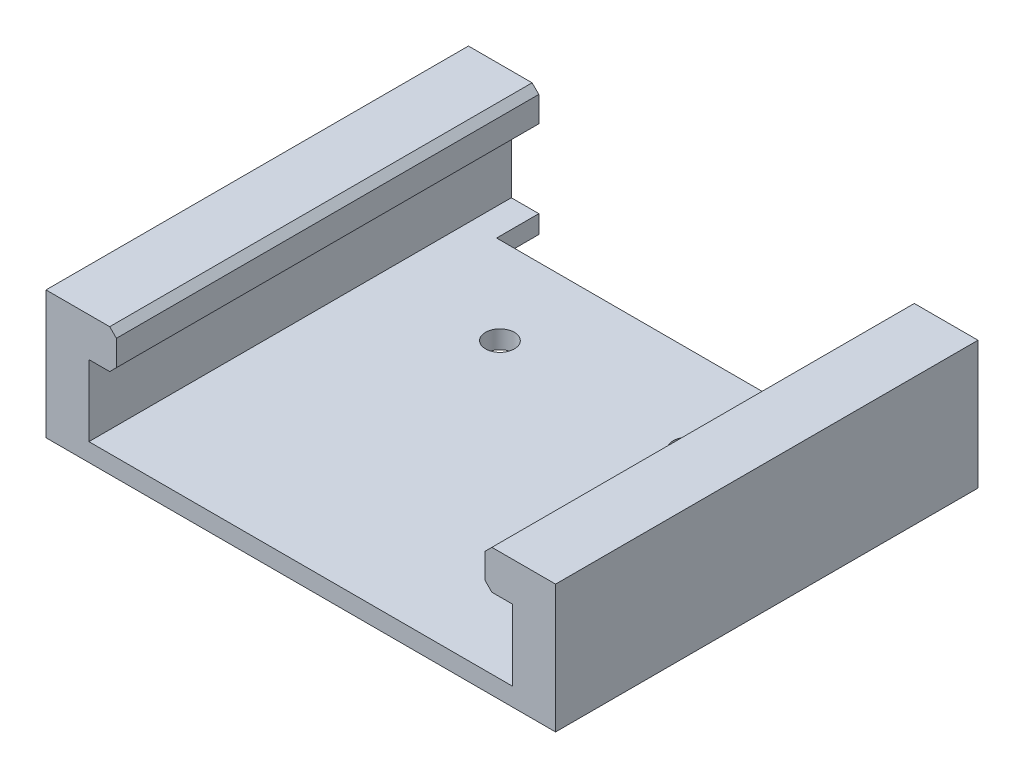
ISO-10303-21;
HEADER;
FILE_DESCRIPTION(('STEP AP214'),'2;1');
FILE_NAME('part.step','',(''),(''),'','','');
FILE_SCHEMA(('AUTOMOTIVE_DESIGN { 1 0 10303 214 1 1 1 1 }'));
ENDSEC;
DATA;
#1=APPLICATION_CONTEXT('core data for automotive mechanical design processes');
#2=APPLICATION_PROTOCOL_DEFINITION('international standard','automotive_design',2000,#1);
#3=PRODUCT_CONTEXT('',#1,'mechanical');
#4=PRODUCT('Part','Part','',(#3));
#5=PRODUCT_RELATED_PRODUCT_CATEGORY('part','',(#4));
#6=PRODUCT_DEFINITION_FORMATION('','',#4);
#7=PRODUCT_DEFINITION_CONTEXT('part definition',#1,'design');
#8=PRODUCT_DEFINITION('design','',#6,#7);
#9=PRODUCT_DEFINITION_SHAPE('','',#8);
#10=(LENGTH_UNIT() NAMED_UNIT(*) SI_UNIT(.MILLI.,.METRE.));
#11=(NAMED_UNIT(*) PLANE_ANGLE_UNIT() SI_UNIT($,.RADIAN.));
#12=(NAMED_UNIT(*) SI_UNIT($,.STERADIAN.) SOLID_ANGLE_UNIT());
#13=UNCERTAINTY_MEASURE_WITH_UNIT(LENGTH_MEASURE(1.E-05),#10,'distance_accuracy_value','');
#14=(GEOMETRIC_REPRESENTATION_CONTEXT(3) GLOBAL_UNCERTAINTY_ASSIGNED_CONTEXT((#13)) GLOBAL_UNIT_ASSIGNED_CONTEXT((#10,
#11,#12)) REPRESENTATION_CONTEXT('',''));
#15=CARTESIAN_POINT('',(0.,0.,0.));
#16=DIRECTION('',(0.,0.,1.));
#17=DIRECTION('',(1.,0.,0.));
#18=AXIS2_PLACEMENT_3D('',#15,#16,#17);
#19=CARTESIAN_POINT('',(0.,0.,-31.5));
#20=DIRECTION('',(0.,0.,-1.));
#21=DIRECTION('',(-1.,0.,0.));
#22=AXIS2_PLACEMENT_3D('',#19,#20,#21);
#23=PLANE('',#22);
#24=DIRECTION('',(1.,0.,0.));
#25=VECTOR('',#24,1.);
#26=CARTESIAN_POINT('',(27.5,13.3,-31.5));
#27=LINE('',#26,#25);
#28=CARTESIAN_POINT('',(28.5,13.3,-31.5));
#29=VERTEX_POINT('',#28);
#30=CARTESIAN_POINT('',(31.6,13.3,-31.5));
#31=VERTEX_POINT('',#30);
#32=EDGE_CURVE('E281',#29,#31,#27,.T.);
#33=ORIENTED_EDGE('',*,*,#32,.F.);
#34=DIRECTION('',(0.707106781186548,-0.707106781186548,0.));
#35=VECTOR('',#34,1.);
#36=CARTESIAN_POINT('',(20.9,20.9,-31.5));
#37=LINE('',#36,#35);
#38=CARTESIAN_POINT('',(27.5,14.3,-31.5));
#39=VERTEX_POINT('',#38);
#40=EDGE_CURVE('E337',#29,#39,#37,.F.);
#41=ORIENTED_EDGE('',*,*,#40,.T.);
#42=DIRECTION('',(0.,-1.,0.));
#43=VECTOR('',#42,1.);
#44=CARTESIAN_POINT('',(27.5,19.1,-31.5));
#45=LINE('',#44,#43);
#46=CARTESIAN_POINT('',(27.5,18.1,-31.5));
#47=VERTEX_POINT('',#46);
#48=EDGE_CURVE('E277',#47,#39,#45,.T.);
#49=ORIENTED_EDGE('',*,*,#48,.F.);
#50=DIRECTION('',(-0.707106781186548,-0.707106781186548,0.));
#51=VECTOR('',#50,1.);
#52=CARTESIAN_POINT('',(4.70000000000001,-4.70000000000001,-31.5));
#53=LINE('',#52,#51);
#54=CARTESIAN_POINT('',(28.5,19.1,-31.5));
#55=VERTEX_POINT('',#54);
#56=EDGE_CURVE('E334',#47,#55,#53,.F.);
#57=ORIENTED_EDGE('',*,*,#56,.T.);
#58=DIRECTION('',(-1.,0.,0.));
#59=VECTOR('',#58,1.);
#60=CARTESIAN_POINT('',(27.5,19.1,-31.5));
#61=LINE('',#60,#59);
#62=CARTESIAN_POINT('',(38.,19.1,-31.5));
#63=VERTEX_POINT('',#62);
#64=EDGE_CURVE('E274',#63,#55,#61,.T.);
#65=ORIENTED_EDGE('',*,*,#64,.F.);
#66=DIRECTION('',(0.,1.,0.));
#67=VECTOR('',#66,1.);
#68=CARTESIAN_POINT('',(38.,19.1,-31.5));
#69=LINE('',#68,#67);
#70=CARTESIAN_POINT('',(38.,0.,-31.5));
#71=VERTEX_POINT('',#70);
#72=EDGE_CURVE('E260',#71,#63,#69,.T.);
#73=ORIENTED_EDGE('',*,*,#72,.F.);
#74=DIRECTION('',(1.,0.,0.));
#75=VECTOR('',#74,1.);
#76=CARTESIAN_POINT('',(-38.,0.,-31.5));
#77=LINE('',#76,#75);
#78=CARTESIAN_POINT('',(27.5,0.,-31.5));
#79=VERTEX_POINT('',#78);
#80=EDGE_CURVE('E250',#79,#71,#77,.T.);
#81=ORIENTED_EDGE('',*,*,#80,.F.);
#82=DIRECTION('',(0.,1.,0.));
#83=VECTOR('',#82,1.);
#84=CARTESIAN_POINT('',(27.5,-0.00100000000000013,-31.5));
#85=LINE('',#84,#83);
#86=CARTESIAN_POINT('',(27.5,2.7,-31.5));
#87=VERTEX_POINT('',#86);
#88=EDGE_CURVE('E231',#79,#87,#85,.T.);
#89=ORIENTED_EDGE('',*,*,#88,.T.);
#90=DIRECTION('',(-1.,0.,0.));
#91=VECTOR('',#90,1.);
#92=CARTESIAN_POINT('',(-31.6,2.7,-31.5));
#93=LINE('',#92,#91);
#94=CARTESIAN_POINT('',(31.6,2.7,-31.5));
#95=VERTEX_POINT('',#94);
#96=EDGE_CURVE('E288',#95,#87,#93,.T.);
#97=ORIENTED_EDGE('',*,*,#96,.F.);
#98=DIRECTION('',(0.,-1.,0.));
#99=VECTOR('',#98,1.);
#100=CARTESIAN_POINT('',(31.6,13.3,-31.5));
#101=LINE('',#100,#99);
#102=EDGE_CURVE('E284',#31,#95,#101,.T.);
#103=ORIENTED_EDGE('',*,*,#102,.F.);
#104=EDGE_LOOP('',(#33,#41,#49,#57,#65,#73,#81,#89,#97,#103));
#105=FACE_BOUND('',#104,.T.);
#106=ADVANCED_FACE('F40',(#105),#23,.T.);
#107=CARTESIAN_POINT('',(-38.,0.,31.5));
#108=DIRECTION('',(0.,1.,0.));
#109=DIRECTION('',(0.,0.,1.));
#110=AXIS2_PLACEMENT_3D('',#107,#108,#109);
#111=PLANE('',#110);
#112=CARTESIAN_POINT('',(14.,0.,-12.2));
#113=DIRECTION('',(0.,-1.,0.));
#114=DIRECTION('',(0.,0.,-1.));
#115=AXIS2_PLACEMENT_3D('',#112,#113,#114);
#116=CIRCLE('',#115,2.15);
#117=CARTESIAN_POINT('',(14.,0.,-14.35));
#118=VERTEX_POINT('',#117);
#119=EDGE_CURVE('E509',#118,#118,#116,.T.);
#120=ORIENTED_EDGE('',*,*,#119,.F.);
#121=EDGE_LOOP('',(#120));
#122=FACE_BOUND('',#121,.T.);
#123=DIRECTION('',(-1.,0.,0.));
#124=VECTOR('',#123,1.);
#125=CARTESIAN_POINT('',(-27.5,0.,-25.2));
#126=LINE('',#125,#124);
#127=CARTESIAN_POINT('',(27.5,0.,-25.2));
#128=VERTEX_POINT('',#127);
#129=CARTESIAN_POINT('',(-27.5,0.,-25.2));
#130=VERTEX_POINT('',#129);
#131=EDGE_CURVE('E254',#128,#130,#126,.T.);
#132=ORIENTED_EDGE('',*,*,#131,.F.);
#133=DIRECTION('',(0.,0.,1.));
#134=VECTOR('',#133,1.);
#135=CARTESIAN_POINT('',(27.5,0.,-31.5));
#136=LINE('',#135,#134);
#137=EDGE_CURVE('E234',#79,#128,#136,.T.);
#138=ORIENTED_EDGE('',*,*,#137,.F.);
#139=ORIENTED_EDGE('',*,*,#80,.T.);
#140=DIRECTION('',(0.,0.,-1.));
#141=VECTOR('',#140,1.);
#142=CARTESIAN_POINT('',(38.,0.,31.5));
#143=LINE('',#142,#141);
#144=CARTESIAN_POINT('',(38.,0.,31.5));
#145=VERTEX_POINT('',#144);
#146=EDGE_CURVE('E319',#145,#71,#143,.T.);
#147=ORIENTED_EDGE('',*,*,#146,.F.);
#148=DIRECTION('',(1.,0.,0.));
#149=VECTOR('',#148,1.);
#150=CARTESIAN_POINT('',(-38.,0.,31.5));
#151=LINE('',#150,#149);
#152=CARTESIAN_POINT('',(-38.,0.,31.5));
#153=VERTEX_POINT('',#152);
#154=EDGE_CURVE('E430',#153,#145,#151,.T.);
#155=ORIENTED_EDGE('',*,*,#154,.F.);
#156=DIRECTION('',(0.,0.,-1.));
#157=VECTOR('',#156,1.);
#158=CARTESIAN_POINT('',(-38.,0.,31.5));
#159=LINE('',#158,#157);
#160=CARTESIAN_POINT('',(-38.,0.,-31.5));
#161=VERTEX_POINT('',#160);
#162=EDGE_CURVE('E322',#153,#161,#159,.T.);
#163=ORIENTED_EDGE('',*,*,#162,.T.);
#164=CARTESIAN_POINT('',(-27.5,0.,-31.5));
#165=VERTEX_POINT('',#164);
#166=EDGE_CURVE('E262',#161,#165,#77,.T.);
#167=ORIENTED_EDGE('',*,*,#166,.T.);
#168=DIRECTION('',(0.,0.,-1.));
#169=VECTOR('',#168,1.);
#170=CARTESIAN_POINT('',(-27.5,0.,-31.5));
#171=LINE('',#170,#169);
#172=EDGE_CURVE('E531',#130,#165,#171,.T.);
#173=ORIENTED_EDGE('',*,*,#172,.F.);
#174=EDGE_LOOP('',(#132,#138,#139,#147,#155,#163,#167,#173));
#175=FACE_BOUND('',#174,.T.);
#176=CARTESIAN_POINT('',(34.8,0.,-25.5));
#177=DIRECTION('',(0.,-1.,0.));
#178=DIRECTION('',(0.,0.,-1.));
#179=AXIS2_PLACEMENT_3D('',#176,#177,#178);
#180=CIRCLE('',#179,1.5);
#181=CARTESIAN_POINT('',(34.8,0.,-27.));
#182=VERTEX_POINT('',#181);
#183=EDGE_CURVE('E446',#182,#182,#180,.T.);
#184=ORIENTED_EDGE('',*,*,#183,.F.);
#185=EDGE_LOOP('',(#184));
#186=FACE_BOUND('',#185,.T.);
#187=CARTESIAN_POINT('',(34.8,0.,25.5));
#188=DIRECTION('',(0.,-1.,0.));
#189=DIRECTION('',(0.,0.,-1.));
#190=AXIS2_PLACEMENT_3D('',#187,#188,#189);
#191=CIRCLE('',#190,1.5);
#192=CARTESIAN_POINT('',(34.8,0.,24.));
#193=VERTEX_POINT('',#192);
#194=EDGE_CURVE('E462',#193,#193,#191,.T.);
#195=ORIENTED_EDGE('',*,*,#194,.F.);
#196=EDGE_LOOP('',(#195));
#197=FACE_BOUND('',#196,.T.);
#198=CARTESIAN_POINT('',(-34.8,0.,25.5));
#199=DIRECTION('',(0.,-1.,0.));
#200=DIRECTION('',(0.,0.,-1.));
#201=AXIS2_PLACEMENT_3D('',#198,#199,#200);
#202=CIRCLE('',#201,1.5);
#203=CARTESIAN_POINT('',(-34.8,0.,24.));
#204=VERTEX_POINT('',#203);
#205=EDGE_CURVE('E478',#204,#204,#202,.T.);
#206=ORIENTED_EDGE('',*,*,#205,.F.);
#207=EDGE_LOOP('',(#206));
#208=FACE_BOUND('',#207,.T.);
#209=CARTESIAN_POINT('',(-34.8,0.,-25.5));
#210=DIRECTION('',(0.,-1.,0.));
#211=DIRECTION('',(0.,0.,-1.));
#212=AXIS2_PLACEMENT_3D('',#209,#210,#211);
#213=CIRCLE('',#212,1.5);
#214=CARTESIAN_POINT('',(-34.8,0.,-27.));
#215=VERTEX_POINT('',#214);
#216=EDGE_CURVE('E493',#215,#215,#213,.T.);
#217=ORIENTED_EDGE('',*,*,#216,.F.);
#218=EDGE_LOOP('',(#217));
#219=FACE_BOUND('',#218,.T.);
#220=CARTESIAN_POINT('',(-14.,0.,-12.2));
#221=DIRECTION('',(0.,-1.,0.));
#222=DIRECTION('',(0.,0.,-1.));
#223=AXIS2_PLACEMENT_3D('',#220,#221,#222);
#224=CIRCLE('',#223,2.15);
#225=CARTESIAN_POINT('',(-14.,0.,-14.35));
#226=VERTEX_POINT('',#225);
#227=EDGE_CURVE('E501',#226,#226,#224,.T.);
#228=ORIENTED_EDGE('',*,*,#227,.F.);
#229=EDGE_LOOP('',(#228));
#230=FACE_BOUND('',#229,.T.);
#231=ADVANCED_FACE('F247',(#122,#175,#186,#197,#208,#219,#230),#111,.F.);
#232=CARTESIAN_POINT('',(-27.5,19.1,31.5));
#233=DIRECTION('',(-1.,0.,0.));
#234=DIRECTION('',(0.,-1.,0.));
#235=AXIS2_PLACEMENT_3D('',#232,#233,#234);
#236=PLANE('',#235);
#237=DIRECTION('',(0.,1.,0.));
#238=VECTOR('',#237,1.);
#239=CARTESIAN_POINT('',(-27.5,19.1,-31.5));
#240=LINE('',#239,#238);
#241=CARTESIAN_POINT('',(-27.5,14.3,-31.5));
#242=VERTEX_POINT('',#241);
#243=CARTESIAN_POINT('',(-27.5,18.1,-31.5));
#244=VERTEX_POINT('',#243);
#245=EDGE_CURVE('E381',#242,#244,#240,.T.);
#246=ORIENTED_EDGE('',*,*,#245,.T.);
#247=DIRECTION('',(0.,0.,1.));
#248=VECTOR('',#247,1.);
#249=CARTESIAN_POINT('',(-27.5,18.1,31.5));
#250=LINE('',#249,#248);
#251=CARTESIAN_POINT('',(-27.5,18.1,31.5));
#252=VERTEX_POINT('',#251);
#253=EDGE_CURVE('E49',#244,#252,#250,.T.);
#254=ORIENTED_EDGE('',*,*,#253,.T.);
#255=DIRECTION('',(0.,1.,0.));
#256=VECTOR('',#255,1.);
#257=CARTESIAN_POINT('',(-27.5,19.1,31.5));
#258=LINE('',#257,#256);
#259=CARTESIAN_POINT('',(-27.5,14.3,31.5));
#260=VERTEX_POINT('',#259);
#261=EDGE_CURVE('E297',#260,#252,#258,.T.);
#262=ORIENTED_EDGE('',*,*,#261,.F.);
#263=DIRECTION('',(0.,0.,-1.));
#264=VECTOR('',#263,1.);
#265=CARTESIAN_POINT('',(-27.5,14.3,31.5));
#266=LINE('',#265,#264);
#267=EDGE_CURVE('E370',#260,#242,#266,.T.);
#268=ORIENTED_EDGE('',*,*,#267,.T.);
#269=EDGE_LOOP('',(#246,#254,#262,#268));
#270=FACE_BOUND('',#269,.T.);
#271=ADVANCED_FACE('F379',(#270),#236,.F.);
#272=CARTESIAN_POINT('',(-27.5,19.1,31.5));
#273=DIRECTION('',(0.,-1.,0.));
#274=DIRECTION('',(0.,0.,-1.));
#275=AXIS2_PLACEMENT_3D('',#272,#273,#274);
#276=PLANE('',#275);
#277=DIRECTION('',(-1.,0.,0.));
#278=VECTOR('',#277,1.);
#279=CARTESIAN_POINT('',(-27.5,19.1,31.5));
#280=LINE('',#279,#278);
#281=CARTESIAN_POINT('',(-28.5,19.1,31.5));
#282=VERTEX_POINT('',#281);
#283=CARTESIAN_POINT('',(-38.,19.1,31.5));
#284=VERTEX_POINT('',#283);
#285=EDGE_CURVE('E390',#282,#284,#280,.T.);
#286=ORIENTED_EDGE('',*,*,#285,.F.);
#287=DIRECTION('',(0.,0.,-1.));
#288=VECTOR('',#287,1.);
#289=CARTESIAN_POINT('',(-28.5,19.1,31.5));
#290=LINE('',#289,#288);
#291=CARTESIAN_POINT('',(-28.5,19.1,-31.5));
#292=VERTEX_POINT('',#291);
#293=EDGE_CURVE('E362',#282,#292,#290,.T.);
#294=ORIENTED_EDGE('',*,*,#293,.T.);
#295=DIRECTION('',(-1.,0.,0.));
#296=VECTOR('',#295,1.);
#297=CARTESIAN_POINT('',(-27.5,19.1,-31.5));
#298=LINE('',#297,#296);
#299=CARTESIAN_POINT('',(-38.,19.1,-31.5));
#300=VERTEX_POINT('',#299);
#301=EDGE_CURVE('E269',#292,#300,#298,.T.);
#302=ORIENTED_EDGE('',*,*,#301,.T.);
#303=DIRECTION('',(0.,0.,-1.));
#304=VECTOR('',#303,1.);
#305=CARTESIAN_POINT('',(-38.,19.1,31.5));
#306=LINE('',#305,#304);
#307=EDGE_CURVE('E326',#284,#300,#306,.T.);
#308=ORIENTED_EDGE('',*,*,#307,.F.);
#309=EDGE_LOOP('',(#286,#294,#302,#308));
#310=FACE_BOUND('',#309,.T.);
#311=ADVANCED_FACE('F395',(#310),#276,.F.);
#312=CARTESIAN_POINT('',(-38.,19.1,31.5));
#313=DIRECTION('',(1.,0.,0.));
#314=DIRECTION('',(0.,0.,-1.));
#315=AXIS2_PLACEMENT_3D('',#312,#313,#314);
#316=PLANE('',#315);
#317=DIRECTION('',(0.,-1.,0.));
#318=VECTOR('',#317,1.);
#319=CARTESIAN_POINT('',(-38.,19.1,-31.5));
#320=LINE('',#319,#318);
#321=EDGE_CURVE('E263',#300,#161,#320,.T.);
#322=ORIENTED_EDGE('',*,*,#321,.T.);
#323=ORIENTED_EDGE('',*,*,#162,.F.);
#324=DIRECTION('',(0.,-1.,0.));
#325=VECTOR('',#324,1.);
#326=CARTESIAN_POINT('',(-38.,19.1,31.5));
#327=LINE('',#326,#325);
#328=EDGE_CURVE('E433',#284,#153,#327,.T.);
#329=ORIENTED_EDGE('',*,*,#328,.F.);
#330=ORIENTED_EDGE('',*,*,#307,.T.);
#331=EDGE_LOOP('',(#322,#323,#329,#330));
#332=FACE_BOUND('',#331,.T.);
#333=ADVANCED_FACE('F543',(#332),#316,.F.);
#334=CARTESIAN_POINT('',(38.,19.1,31.5));
#335=DIRECTION('',(-1.,0.,0.));
#336=DIRECTION('',(0.,0.,1.));
#337=AXIS2_PLACEMENT_3D('',#334,#335,#336);
#338=PLANE('',#337);
#339=ORIENTED_EDGE('',*,*,#72,.T.);
#340=DIRECTION('',(0.,0.,-1.));
#341=VECTOR('',#340,1.);
#342=CARTESIAN_POINT('',(38.,19.1,31.5));
#343=LINE('',#342,#341);
#344=CARTESIAN_POINT('',(38.,19.1,31.5));
#345=VERTEX_POINT('',#344);
#346=EDGE_CURVE('E315',#345,#63,#343,.T.);
#347=ORIENTED_EDGE('',*,*,#346,.F.);
#348=DIRECTION('',(0.,1.,0.));
#349=VECTOR('',#348,1.);
#350=CARTESIAN_POINT('',(38.,19.1,31.5));
#351=LINE('',#350,#349);
#352=EDGE_CURVE('E427',#145,#345,#351,.T.);
#353=ORIENTED_EDGE('',*,*,#352,.F.);
#354=ORIENTED_EDGE('',*,*,#146,.T.);
#355=EDGE_LOOP('',(#339,#347,#353,#354));
#356=FACE_BOUND('',#355,.T.);
#357=ADVANCED_FACE('F547',(#356),#338,.F.);
#358=CARTESIAN_POINT('',(27.5,19.1,31.5));
#359=DIRECTION('',(0.,-1.,0.));
#360=DIRECTION('',(0.,0.,-1.));
#361=AXIS2_PLACEMENT_3D('',#358,#359,#360);
#362=PLANE('',#361);
#363=ORIENTED_EDGE('',*,*,#64,.T.);
#364=DIRECTION('',(0.,0.,1.));
#365=VECTOR('',#364,1.);
#366=CARTESIAN_POINT('',(28.5,19.1,31.5));
#367=LINE('',#366,#365);
#368=CARTESIAN_POINT('',(28.5,19.1,31.5));
#369=VERTEX_POINT('',#368);
#370=EDGE_CURVE('E359',#55,#369,#367,.T.);
#371=ORIENTED_EDGE('',*,*,#370,.T.);
#372=DIRECTION('',(-1.,0.,0.));
#373=VECTOR('',#372,1.);
#374=CARTESIAN_POINT('',(27.5,19.1,31.5));
#375=LINE('',#374,#373);
#376=EDGE_CURVE('E423',#345,#369,#375,.T.);
#377=ORIENTED_EDGE('',*,*,#376,.F.);
#378=ORIENTED_EDGE('',*,*,#346,.T.);
#379=EDGE_LOOP('',(#363,#371,#377,#378));
#380=FACE_BOUND('',#379,.T.);
#381=ADVANCED_FACE('F550',(#380),#362,.F.);
#382=CARTESIAN_POINT('',(27.5,19.1,31.5));
#383=DIRECTION('',(1.,0.,0.));
#384=DIRECTION('',(0.,1.,0.));
#385=AXIS2_PLACEMENT_3D('',#382,#383,#384);
#386=PLANE('',#385);
#387=ORIENTED_EDGE('',*,*,#48,.T.);
#388=DIRECTION('',(0.,0.,1.));
#389=VECTOR('',#388,1.);
#390=CARTESIAN_POINT('',(27.5,14.3,31.5));
#391=LINE('',#390,#389);
#392=CARTESIAN_POINT('',(27.5,14.3,31.5));
#393=VERTEX_POINT('',#392);
#394=EDGE_CURVE('E344',#39,#393,#391,.T.);
#395=ORIENTED_EDGE('',*,*,#394,.T.);
#396=DIRECTION('',(0.,-1.,0.));
#397=VECTOR('',#396,1.);
#398=CARTESIAN_POINT('',(27.5,19.1,31.5));
#399=LINE('',#398,#397);
#400=CARTESIAN_POINT('',(27.5,18.1,31.5));
#401=VERTEX_POINT('',#400);
#402=EDGE_CURVE('E420',#401,#393,#399,.T.);
#403=ORIENTED_EDGE('',*,*,#402,.F.);
#404=DIRECTION('',(0.,0.,-1.));
#405=VECTOR('',#404,1.);
#406=CARTESIAN_POINT('',(27.5,18.1,31.5));
#407=LINE('',#406,#405);
#408=EDGE_CURVE('E340',#401,#47,#407,.T.);
#409=ORIENTED_EDGE('',*,*,#408,.T.);
#410=EDGE_LOOP('',(#387,#395,#403,#409));
#411=FACE_BOUND('',#410,.T.);
#412=ADVANCED_FACE('F559',(#411),#386,.F.);
#413=CARTESIAN_POINT('',(27.5,13.3,31.5));
#414=DIRECTION('',(0.,1.,0.));
#415=DIRECTION('',(0.,0.,1.));
#416=AXIS2_PLACEMENT_3D('',#413,#414,#415);
#417=PLANE('',#416);
#418=DIRECTION('',(1.,0.,0.));
#419=VECTOR('',#418,1.);
#420=CARTESIAN_POINT('',(27.5,13.3,31.5));
#421=LINE('',#420,#419);
#422=CARTESIAN_POINT('',(28.5,13.3,31.5));
#423=VERTEX_POINT('',#422);
#424=CARTESIAN_POINT('',(31.6,13.3,31.5));
#425=VERTEX_POINT('',#424);
#426=EDGE_CURVE('E417',#423,#425,#421,.T.);
#427=ORIENTED_EDGE('',*,*,#426,.F.);
#428=DIRECTION('',(0.,0.,-1.));
#429=VECTOR('',#428,1.);
#430=CARTESIAN_POINT('',(28.5,13.3,31.5));
#431=LINE('',#430,#429);
#432=EDGE_CURVE('E330',#423,#29,#431,.T.);
#433=ORIENTED_EDGE('',*,*,#432,.T.);
#434=ORIENTED_EDGE('',*,*,#32,.T.);
#435=DIRECTION('',(0.,0.,-1.));
#436=VECTOR('',#435,1.);
#437=CARTESIAN_POINT('',(31.6,13.3,31.5));
#438=LINE('',#437,#436);
#439=EDGE_CURVE('E311',#425,#31,#438,.T.);
#440=ORIENTED_EDGE('',*,*,#439,.F.);
#441=EDGE_LOOP('',(#427,#433,#434,#440));
#442=FACE_BOUND('',#441,.T.);
#443=ADVANCED_FACE('F568',(#442),#417,.F.);
#444=CARTESIAN_POINT('',(31.6,13.3,31.5));
#445=DIRECTION('',(1.,0.,0.));
#446=DIRECTION('',(0.,1.,0.));
#447=AXIS2_PLACEMENT_3D('',#444,#445,#446);
#448=PLANE('',#447);
#449=ORIENTED_EDGE('',*,*,#102,.T.);
#450=DIRECTION('',(0.,0.,-1.));
#451=VECTOR('',#450,1.);
#452=CARTESIAN_POINT('',(31.6,2.7,31.5));
#453=LINE('',#452,#451);
#454=CARTESIAN_POINT('',(31.6,2.7,31.5));
#455=VERTEX_POINT('',#454);
#456=EDGE_CURVE('E307',#455,#95,#453,.T.);
#457=ORIENTED_EDGE('',*,*,#456,.F.);
#458=DIRECTION('',(0.,-1.,0.));
#459=VECTOR('',#458,1.);
#460=CARTESIAN_POINT('',(31.6,13.3,31.5));
#461=LINE('',#460,#459);
#462=EDGE_CURVE('E414',#425,#455,#461,.T.);
#463=ORIENTED_EDGE('',*,*,#462,.F.);
#464=ORIENTED_EDGE('',*,*,#439,.T.);
#465=EDGE_LOOP('',(#449,#457,#463,#464));
#466=FACE_BOUND('',#465,.T.);
#467=ADVANCED_FACE('F575',(#466),#448,.F.);
#468=CARTESIAN_POINT('',(-31.6,2.7,31.5));
#469=DIRECTION('',(0.,-1.,0.));
#470=DIRECTION('',(0.,0.,-1.));
#471=AXIS2_PLACEMENT_3D('',#468,#469,#470);
#472=PLANE('',#471);
#473=CARTESIAN_POINT('',(14.,2.7,-12.2));
#474=DIRECTION('',(0.,-1.,0.));
#475=DIRECTION('',(0.,0.,-1.));
#476=AXIS2_PLACEMENT_3D('',#473,#474,#475);
#477=CIRCLE('',#476,2.15);
#478=CARTESIAN_POINT('',(14.,2.7,-14.35));
#479=VERTEX_POINT('',#478);
#480=EDGE_CURVE('E505',#479,#479,#477,.T.);
#481=ORIENTED_EDGE('',*,*,#480,.T.);
#482=EDGE_LOOP('',(#481));
#483=FACE_BOUND('',#482,.T.);
#484=CARTESIAN_POINT('',(-14.,2.7,-12.2));
#485=DIRECTION('',(0.,-1.,0.));
#486=DIRECTION('',(0.,0.,-1.));
#487=AXIS2_PLACEMENT_3D('',#484,#485,#486);
#488=CIRCLE('',#487,2.15);
#489=CARTESIAN_POINT('',(-14.,2.7,-14.35));
#490=VERTEX_POINT('',#489);
#491=EDGE_CURVE('E497',#490,#490,#488,.T.);
#492=ORIENTED_EDGE('',*,*,#491,.T.);
#493=EDGE_LOOP('',(#492));
#494=FACE_BOUND('',#493,.T.);
#495=ORIENTED_EDGE('',*,*,#96,.T.);
#496=DIRECTION('',(0.,0.,-1.));
#497=VECTOR('',#496,1.);
#498=CARTESIAN_POINT('',(27.5,2.7,-31.5));
#499=LINE('',#498,#497);
#500=CARTESIAN_POINT('',(27.5,2.7,-25.2));
#501=VERTEX_POINT('',#500);
#502=EDGE_CURVE('E237',#501,#87,#499,.T.);
#503=ORIENTED_EDGE('',*,*,#502,.F.);
#504=DIRECTION('',(1.,0.,0.));
#505=VECTOR('',#504,1.);
#506=CARTESIAN_POINT('',(-27.5,2.7,-25.2));
#507=LINE('',#506,#505);
#508=CARTESIAN_POINT('',(-27.5,2.7,-25.2));
#509=VERTEX_POINT('',#508);
#510=EDGE_CURVE('E244',#509,#501,#507,.T.);
#511=ORIENTED_EDGE('',*,*,#510,.F.);
#512=DIRECTION('',(0.,0.,1.));
#513=VECTOR('',#512,1.);
#514=CARTESIAN_POINT('',(-27.5,2.7,-31.5));
#515=LINE('',#514,#513);
#516=CARTESIAN_POINT('',(-27.5,2.7,-31.5));
#517=VERTEX_POINT('',#516);
#518=EDGE_CURVE('E524',#517,#509,#515,.T.);
#519=ORIENTED_EDGE('',*,*,#518,.F.);
#520=CARTESIAN_POINT('',(-31.6,2.7,-31.5));
#521=VERTEX_POINT('',#520);
#522=EDGE_CURVE('E287',#517,#521,#93,.T.);
#523=ORIENTED_EDGE('',*,*,#522,.T.);
#524=DIRECTION('',(0.,0.,-1.));
#525=VECTOR('',#524,1.);
#526=CARTESIAN_POINT('',(-31.6,2.7,31.5));
#527=LINE('',#526,#525);
#528=CARTESIAN_POINT('',(-31.6,2.7,31.5));
#529=VERTEX_POINT('',#528);
#530=EDGE_CURVE('E302',#529,#521,#527,.T.);
#531=ORIENTED_EDGE('',*,*,#530,.F.);
#532=DIRECTION('',(-1.,0.,0.));
#533=VECTOR('',#532,1.);
#534=CARTESIAN_POINT('',(-31.6,2.7,31.5));
#535=LINE('',#534,#533);
#536=EDGE_CURVE('E411',#455,#529,#535,.T.);
#537=ORIENTED_EDGE('',*,*,#536,.F.);
#538=ORIENTED_EDGE('',*,*,#456,.T.);
#539=EDGE_LOOP('',(#495,#503,#511,#519,#523,#531,#537,#538));
#540=FACE_BOUND('',#539,.T.);
#541=ADVANCED_FACE('F577',(#483,#494,#540),#472,.F.);
#542=CARTESIAN_POINT('',(-31.6,13.3,31.5));
#543=DIRECTION('',(-1.,0.,0.));
#544=DIRECTION('',(0.,-1.,0.));
#545=AXIS2_PLACEMENT_3D('',#542,#543,#544);
#546=PLANE('',#545);
#547=DIRECTION('',(0.,1.,0.));
#548=VECTOR('',#547,1.);
#549=CARTESIAN_POINT('',(-31.6,13.3,-31.5));
#550=LINE('',#549,#548);
#551=CARTESIAN_POINT('',(-31.6,13.3,-31.5));
#552=VERTEX_POINT('',#551);
#553=EDGE_CURVE('E291',#521,#552,#550,.T.);
#554=ORIENTED_EDGE('',*,*,#553,.T.);
#555=DIRECTION('',(0.,0.,-1.));
#556=VECTOR('',#555,1.);
#557=CARTESIAN_POINT('',(-31.6,13.3,31.5));
#558=LINE('',#557,#556);
#559=CARTESIAN_POINT('',(-31.6,13.3,31.5));
#560=VERTEX_POINT('',#559);
#561=EDGE_CURVE('E298',#560,#552,#558,.T.);
#562=ORIENTED_EDGE('',*,*,#561,.F.);
#563=DIRECTION('',(0.,1.,0.));
#564=VECTOR('',#563,1.);
#565=CARTESIAN_POINT('',(-31.6,13.3,31.5));
#566=LINE('',#565,#564);
#567=EDGE_CURVE('E408',#529,#560,#566,.T.);
#568=ORIENTED_EDGE('',*,*,#567,.F.);
#569=ORIENTED_EDGE('',*,*,#530,.T.);
#570=EDGE_LOOP('',(#554,#562,#568,#569));
#571=FACE_BOUND('',#570,.T.);
#572=ADVANCED_FACE('F581',(#571),#546,.F.);
#573=CARTESIAN_POINT('',(-27.5,13.3,31.5));
#574=DIRECTION('',(0.,1.,0.));
#575=DIRECTION('',(0.,0.,1.));
#576=AXIS2_PLACEMENT_3D('',#573,#574,#575);
#577=PLANE('',#576);
#578=DIRECTION('',(1.,0.,0.));
#579=VECTOR('',#578,1.);
#580=CARTESIAN_POINT('',(-27.5,13.3,-31.5));
#581=LINE('',#580,#579);
#582=CARTESIAN_POINT('',(-28.5,13.3,-31.5));
#583=VERTEX_POINT('',#582);
#584=EDGE_CURVE('E294',#552,#583,#581,.T.);
#585=ORIENTED_EDGE('',*,*,#584,.T.);
#586=DIRECTION('',(0.,0.,1.));
#587=VECTOR('',#586,1.);
#588=CARTESIAN_POINT('',(-28.5,13.3,31.5));
#589=LINE('',#588,#587);
#590=CARTESIAN_POINT('',(-28.5,13.3,31.5));
#591=VERTEX_POINT('',#590);
#592=EDGE_CURVE('E11',#583,#591,#589,.T.);
#593=ORIENTED_EDGE('',*,*,#592,.T.);
#594=DIRECTION('',(1.,0.,0.));
#595=VECTOR('',#594,1.);
#596=CARTESIAN_POINT('',(-27.5,13.3,31.5));
#597=LINE('',#596,#595);
#598=EDGE_CURVE('E303',#560,#591,#597,.T.);
#599=ORIENTED_EDGE('',*,*,#598,.F.);
#600=ORIENTED_EDGE('',*,*,#561,.T.);
#601=EDGE_LOOP('',(#585,#593,#599,#600));
#602=FACE_BOUND('',#601,.T.);
#603=ADVANCED_FACE('F586',(#602),#577,.F.);
#604=CARTESIAN_POINT('',(0.,0.,31.5));
#605=DIRECTION('',(0.,0.,-1.));
#606=DIRECTION('',(-1.,0.,0.));
#607=AXIS2_PLACEMENT_3D('',#604,#605,#606);
#608=PLANE('',#607);
#609=ORIENTED_EDGE('',*,*,#402,.T.);
#610=DIRECTION('',(-0.707106781186548,0.707106781186548,0.));
#611=VECTOR('',#610,1.);
#612=CARTESIAN_POINT('',(28.5,13.3,31.5));
#613=LINE('',#612,#611);
#614=EDGE_CURVE('E356',#393,#423,#613,.F.);
#615=ORIENTED_EDGE('',*,*,#614,.T.);
#616=ORIENTED_EDGE('',*,*,#426,.T.);
#617=ORIENTED_EDGE('',*,*,#462,.T.);
#618=ORIENTED_EDGE('',*,*,#536,.T.);
#619=ORIENTED_EDGE('',*,*,#567,.T.);
#620=ORIENTED_EDGE('',*,*,#598,.T.);
#621=DIRECTION('',(-0.707106781186548,-0.707106781186548,0.));
#622=VECTOR('',#621,1.);
#623=CARTESIAN_POINT('',(-27.5,14.3,31.5));
#624=LINE('',#623,#622);
#625=EDGE_CURVE('E347',#591,#260,#624,.F.);
#626=ORIENTED_EDGE('',*,*,#625,.T.);
#627=ORIENTED_EDGE('',*,*,#261,.T.);
#628=DIRECTION('',(0.707106781186548,-0.707106781186548,0.));
#629=VECTOR('',#628,1.);
#630=CARTESIAN_POINT('',(-28.5,19.1,31.5));
#631=LINE('',#630,#629);
#632=EDGE_CURVE('E350',#252,#282,#631,.F.);
#633=ORIENTED_EDGE('',*,*,#632,.T.);
#634=ORIENTED_EDGE('',*,*,#285,.T.);
#635=ORIENTED_EDGE('',*,*,#328,.T.);
#636=ORIENTED_EDGE('',*,*,#154,.T.);
#637=ORIENTED_EDGE('',*,*,#352,.T.);
#638=ORIENTED_EDGE('',*,*,#376,.T.);
#639=DIRECTION('',(0.707106781186548,0.707106781186548,0.));
#640=VECTOR('',#639,1.);
#641=CARTESIAN_POINT('',(27.5,18.1,31.5));
#642=LINE('',#641,#640);
#643=EDGE_CURVE('E353',#369,#401,#642,.F.);
#644=ORIENTED_EDGE('',*,*,#643,.T.);
#645=EDGE_LOOP('',(#609,#615,#616,#617,#618,#619,#620,#626,#627,#633,#634,#635,#636,#637,#638,#644));
#646=FACE_BOUND('',#645,.T.);
#647=ADVANCED_FACE('F386',(#646),#608,.F.);
#648=ORIENTED_EDGE('',*,*,#301,.F.);
#649=DIRECTION('',(-0.707106781186548,0.707106781186548,0.));
#650=VECTOR('',#649,1.);
#651=CARTESIAN_POINT('',(-4.7,-4.7,-31.5));
#652=LINE('',#651,#650);
#653=EDGE_CURVE('E68',#292,#244,#652,.F.);
#654=ORIENTED_EDGE('',*,*,#653,.T.);
#655=ORIENTED_EDGE('',*,*,#245,.F.);
#656=DIRECTION('',(0.707106781186548,0.707106781186548,0.));
#657=VECTOR('',#656,1.);
#658=CARTESIAN_POINT('',(-20.9,20.9,-31.5));
#659=LINE('',#658,#657);
#660=EDGE_CURVE('E59',#242,#583,#659,.F.);
#661=ORIENTED_EDGE('',*,*,#660,.T.);
#662=ORIENTED_EDGE('',*,*,#584,.F.);
#663=ORIENTED_EDGE('',*,*,#553,.F.);
#664=ORIENTED_EDGE('',*,*,#522,.F.);
#665=DIRECTION('',(0.,1.,0.));
#666=VECTOR('',#665,1.);
#667=CARTESIAN_POINT('',(-27.5,-0.00100000000000013,-31.5));
#668=LINE('',#667,#666);
#669=EDGE_CURVE('E243',#165,#517,#668,.T.);
#670=ORIENTED_EDGE('',*,*,#669,.F.);
#671=ORIENTED_EDGE('',*,*,#166,.F.);
#672=ORIENTED_EDGE('',*,*,#321,.F.);
#673=EDGE_LOOP('',(#648,#654,#655,#661,#662,#663,#664,#670,#671,#672));
#674=FACE_BOUND('',#673,.T.);
#675=ADVANCED_FACE('F398',(#674),#23,.T.);
#676=CARTESIAN_POINT('',(34.8,14.,-25.5));
#677=DIRECTION('',(0.,-1.,0.));
#678=DIRECTION('',(0.,0.,-1.));
#679=AXIS2_PLACEMENT_3D('',#676,#677,#678);
#680=CONICAL_SURFACE('',#679,1.24999999999999,1.02974425867665);
#681=CARTESIAN_POINT('',(34.8,14.7510757737845,-25.5));
#682=VERTEX_POINT('',#681);
#683=VERTEX_LOOP('',#682);
#684=FACE_BOUND('',#683,.T.);
#685=CARTESIAN_POINT('',(34.8,14.,-25.5));
#686=DIRECTION('',(0.,-1.,0.));
#687=DIRECTION('',(0.,0.,-1.));
#688=AXIS2_PLACEMENT_3D('',#685,#686,#687);
#689=CIRCLE('',#688,1.24999999999999);
#690=CARTESIAN_POINT('',(34.8,14.,-26.75));
#691=VERTEX_POINT('',#690);
#692=EDGE_CURVE('E403',#691,#691,#689,.T.);
#693=ORIENTED_EDGE('',*,*,#692,.T.);
#694=EDGE_LOOP('',(#693));
#695=FACE_BOUND('',#694,.T.);
#696=ADVANCED_FACE('F603',(#684,#695),#680,.F.);
#697=CARTESIAN_POINT('',(34.8,0.,-25.5));
#698=DIRECTION('',(0.,-1.,0.));
#699=DIRECTION('',(0.,0.,-1.));
#700=AXIS2_PLACEMENT_3D('',#697,#698,#699);
#701=CYLINDRICAL_SURFACE('',#700,1.24999999999999);
#702=ORIENTED_EDGE('',*,*,#692,.F.);
#703=EDGE_LOOP('',(#702));
#704=FACE_BOUND('',#703,.T.);
#705=CARTESIAN_POINT('',(34.8,13.5,-25.5));
#706=DIRECTION('',(0.,-1.,0.));
#707=DIRECTION('',(0.,0.,-1.));
#708=AXIS2_PLACEMENT_3D('',#705,#706,#707);
#709=CIRCLE('',#708,1.24999999999999);
#710=CARTESIAN_POINT('',(34.8,13.5,-26.75));
#711=VERTEX_POINT('',#710);
#712=EDGE_CURVE('E440',#711,#711,#709,.T.);
#713=ORIENTED_EDGE('',*,*,#712,.T.);
#714=EDGE_LOOP('',(#713));
#715=FACE_BOUND('',#714,.T.);
#716=ADVANCED_FACE('F607',(#704,#715),#701,.F.);
#717=CARTESIAN_POINT('',(36.05,13.5,-25.5));
#718=DIRECTION('',(0.,1.,0.));
#719=DIRECTION('',(0.,0.,1.));
#720=AXIS2_PLACEMENT_3D('',#717,#718,#719);
#721=PLANE('',#720);
#722=ORIENTED_EDGE('',*,*,#712,.F.);
#723=EDGE_LOOP('',(#722));
#724=FACE_BOUND('',#723,.T.);
#725=CARTESIAN_POINT('',(34.8,13.5,-25.5));
#726=DIRECTION('',(0.,-1.,0.));
#727=DIRECTION('',(0.,0.,-1.));
#728=AXIS2_PLACEMENT_3D('',#725,#726,#727);
#729=CIRCLE('',#728,1.49999999999999);
#730=CARTESIAN_POINT('',(34.8,13.5,-27.));
#731=VERTEX_POINT('',#730);
#732=EDGE_CURVE('E443',#731,#731,#729,.T.);
#733=ORIENTED_EDGE('',*,*,#732,.T.);
#734=EDGE_LOOP('',(#733));
#735=FACE_BOUND('',#734,.T.);
#736=ADVANCED_FACE('F613',(#724,#735),#721,.F.);
#737=CARTESIAN_POINT('',(34.8,0.,-25.5));
#738=DIRECTION('',(0.,-1.,0.));
#739=DIRECTION('',(0.,0.,-1.));
#740=AXIS2_PLACEMENT_3D('',#737,#738,#739);
#741=CYLINDRICAL_SURFACE('',#740,1.5);
#742=ORIENTED_EDGE('',*,*,#732,.F.);
#743=EDGE_LOOP('',(#742));
#744=FACE_BOUND('',#743,.T.);
#745=ORIENTED_EDGE('',*,*,#183,.T.);
#746=EDGE_LOOP('',(#745));
#747=FACE_BOUND('',#746,.T.);
#748=ADVANCED_FACE('F620',(#744,#747),#741,.F.);
#749=CARTESIAN_POINT('',(34.8,14.,25.5));
#750=DIRECTION('',(0.,-1.,0.));
#751=DIRECTION('',(0.,0.,-1.));
#752=AXIS2_PLACEMENT_3D('',#749,#750,#751);
#753=CONICAL_SURFACE('',#752,1.24999999999999,1.02974425867665);
#754=CARTESIAN_POINT('',(34.8,14.7510757737845,25.5));
#755=VERTEX_POINT('',#754);
#756=VERTEX_LOOP('',#755);
#757=FACE_BOUND('',#756,.T.);
#758=CARTESIAN_POINT('',(34.8,14.,25.5));
#759=DIRECTION('',(0.,-1.,0.));
#760=DIRECTION('',(0.,0.,-1.));
#761=AXIS2_PLACEMENT_3D('',#758,#759,#760);
#762=CIRCLE('',#761,1.24999999999999);
#763=CARTESIAN_POINT('',(34.8,14.,24.25));
#764=VERTEX_POINT('',#763);
#765=EDGE_CURVE('E450',#764,#764,#762,.T.);
#766=ORIENTED_EDGE('',*,*,#765,.T.);
#767=EDGE_LOOP('',(#766));
#768=FACE_BOUND('',#767,.T.);
#769=ADVANCED_FACE('F624',(#757,#768),#753,.F.);
#770=CARTESIAN_POINT('',(34.8,0.,25.5));
#771=DIRECTION('',(0.,-1.,0.));
#772=DIRECTION('',(0.,0.,-1.));
#773=AXIS2_PLACEMENT_3D('',#770,#771,#772);
#774=CYLINDRICAL_SURFACE('',#773,1.24999999999999);
#775=ORIENTED_EDGE('',*,*,#765,.F.);
#776=EDGE_LOOP('',(#775));
#777=FACE_BOUND('',#776,.T.);
#778=CARTESIAN_POINT('',(34.8,13.5,25.5));
#779=DIRECTION('',(0.,-1.,0.));
#780=DIRECTION('',(0.,0.,-1.));
#781=AXIS2_PLACEMENT_3D('',#778,#779,#780);
#782=CIRCLE('',#781,1.24999999999999);
#783=CARTESIAN_POINT('',(34.8,13.5,24.25));
#784=VERTEX_POINT('',#783);
#785=EDGE_CURVE('E454',#784,#784,#782,.T.);
#786=ORIENTED_EDGE('',*,*,#785,.T.);
#787=EDGE_LOOP('',(#786));
#788=FACE_BOUND('',#787,.T.);
#789=ADVANCED_FACE('F628',(#777,#788),#774,.F.);
#790=CARTESIAN_POINT('',(36.05,13.5,25.5));
#791=DIRECTION('',(0.,1.,0.));
#792=DIRECTION('',(0.,0.,1.));
#793=AXIS2_PLACEMENT_3D('',#790,#791,#792);
#794=PLANE('',#793);
#795=ORIENTED_EDGE('',*,*,#785,.F.);
#796=EDGE_LOOP('',(#795));
#797=FACE_BOUND('',#796,.T.);
#798=CARTESIAN_POINT('',(34.8,13.5,25.5));
#799=DIRECTION('',(0.,-1.,0.));
#800=DIRECTION('',(0.,0.,-1.));
#801=AXIS2_PLACEMENT_3D('',#798,#799,#800);
#802=CIRCLE('',#801,1.49999999999999);
#803=CARTESIAN_POINT('',(34.8,13.5,24.));
#804=VERTEX_POINT('',#803);
#805=EDGE_CURVE('E458',#804,#804,#802,.T.);
#806=ORIENTED_EDGE('',*,*,#805,.T.);
#807=EDGE_LOOP('',(#806));
#808=FACE_BOUND('',#807,.T.);
#809=ADVANCED_FACE('F632',(#797,#808),#794,.F.);
#810=CARTESIAN_POINT('',(34.8,0.,25.5));
#811=DIRECTION('',(0.,-1.,0.));
#812=DIRECTION('',(0.,0.,-1.));
#813=AXIS2_PLACEMENT_3D('',#810,#811,#812);
#814=CYLINDRICAL_SURFACE('',#813,1.5);
#815=ORIENTED_EDGE('',*,*,#805,.F.);
#816=EDGE_LOOP('',(#815));
#817=FACE_BOUND('',#816,.T.);
#818=ORIENTED_EDGE('',*,*,#194,.T.);
#819=EDGE_LOOP('',(#818));
#820=FACE_BOUND('',#819,.T.);
#821=ADVANCED_FACE('F636',(#817,#820),#814,.F.);
#822=CARTESIAN_POINT('',(-34.8,14.,25.5));
#823=DIRECTION('',(0.,-1.,0.));
#824=DIRECTION('',(0.,0.,-1.));
#825=AXIS2_PLACEMENT_3D('',#822,#823,#824);
#826=CONICAL_SURFACE('',#825,1.24999999999999,1.02974425867665);
#827=CARTESIAN_POINT('',(-34.8,14.7510757737845,25.5));
#828=VERTEX_POINT('',#827);
#829=VERTEX_LOOP('',#828);
#830=FACE_BOUND('',#829,.T.);
#831=CARTESIAN_POINT('',(-34.8,14.,25.5));
#832=DIRECTION('',(0.,-1.,0.));
#833=DIRECTION('',(0.,0.,-1.));
#834=AXIS2_PLACEMENT_3D('',#831,#832,#833);
#835=CIRCLE('',#834,1.24999999999999);
#836=CARTESIAN_POINT('',(-34.8,14.,24.25));
#837=VERTEX_POINT('',#836);
#838=EDGE_CURVE('E466',#837,#837,#835,.T.);
#839=ORIENTED_EDGE('',*,*,#838,.T.);
#840=EDGE_LOOP('',(#839));
#841=FACE_BOUND('',#840,.T.);
#842=ADVANCED_FACE('F640',(#830,#841),#826,.F.);
#843=CARTESIAN_POINT('',(-34.8,0.,25.5));
#844=DIRECTION('',(0.,-1.,0.));
#845=DIRECTION('',(0.,0.,-1.));
#846=AXIS2_PLACEMENT_3D('',#843,#844,#845);
#847=CYLINDRICAL_SURFACE('',#846,1.24999999999999);
#848=ORIENTED_EDGE('',*,*,#838,.F.);
#849=EDGE_LOOP('',(#848));
#850=FACE_BOUND('',#849,.T.);
#851=CARTESIAN_POINT('',(-34.8,13.5,25.5));
#852=DIRECTION('',(0.,-1.,0.));
#853=DIRECTION('',(0.,0.,-1.));
#854=AXIS2_PLACEMENT_3D('',#851,#852,#853);
#855=CIRCLE('',#854,1.24999999999999);
#856=CARTESIAN_POINT('',(-34.8,13.5,24.25));
#857=VERTEX_POINT('',#856);
#858=EDGE_CURVE('E470',#857,#857,#855,.T.);
#859=ORIENTED_EDGE('',*,*,#858,.T.);
#860=EDGE_LOOP('',(#859));
#861=FACE_BOUND('',#860,.T.);
#862=ADVANCED_FACE('F644',(#850,#861),#847,.F.);
#863=CARTESIAN_POINT('',(-33.55,13.5,25.5));
#864=DIRECTION('',(0.,1.,0.));
#865=DIRECTION('',(0.,0.,1.));
#866=AXIS2_PLACEMENT_3D('',#863,#864,#865);
#867=PLANE('',#866);
#868=ORIENTED_EDGE('',*,*,#858,.F.);
#869=EDGE_LOOP('',(#868));
#870=FACE_BOUND('',#869,.T.);
#871=CARTESIAN_POINT('',(-34.8,13.5,25.5));
#872=DIRECTION('',(0.,-1.,0.));
#873=DIRECTION('',(0.,0.,-1.));
#874=AXIS2_PLACEMENT_3D('',#871,#872,#873);
#875=CIRCLE('',#874,1.49999999999999);
#876=CARTESIAN_POINT('',(-34.8,13.5,24.));
#877=VERTEX_POINT('',#876);
#878=EDGE_CURVE('E474',#877,#877,#875,.T.);
#879=ORIENTED_EDGE('',*,*,#878,.T.);
#880=EDGE_LOOP('',(#879));
#881=FACE_BOUND('',#880,.T.);
#882=ADVANCED_FACE('F648',(#870,#881),#867,.F.);
#883=CARTESIAN_POINT('',(-34.8,0.,25.5));
#884=DIRECTION('',(0.,-1.,0.));
#885=DIRECTION('',(0.,0.,-1.));
#886=AXIS2_PLACEMENT_3D('',#883,#884,#885);
#887=CYLINDRICAL_SURFACE('',#886,1.5);
#888=ORIENTED_EDGE('',*,*,#878,.F.);
#889=EDGE_LOOP('',(#888));
#890=FACE_BOUND('',#889,.T.);
#891=ORIENTED_EDGE('',*,*,#205,.T.);
#892=EDGE_LOOP('',(#891));
#893=FACE_BOUND('',#892,.T.);
#894=ADVANCED_FACE('F652',(#890,#893),#887,.F.);
#895=CARTESIAN_POINT('',(-34.8,14.,-25.5));
#896=DIRECTION('',(0.,-1.,0.));
#897=DIRECTION('',(0.,0.,-1.));
#898=AXIS2_PLACEMENT_3D('',#895,#896,#897);
#899=CONICAL_SURFACE('',#898,1.24999999999999,1.02974425867665);
#900=CARTESIAN_POINT('',(-34.8,14.7510757737845,-25.5));
#901=VERTEX_POINT('',#900);
#902=VERTEX_LOOP('',#901);
#903=FACE_BOUND('',#902,.T.);
#904=CARTESIAN_POINT('',(-34.8,14.,-25.5));
#905=DIRECTION('',(0.,-1.,0.));
#906=DIRECTION('',(0.,0.,-1.));
#907=AXIS2_PLACEMENT_3D('',#904,#905,#906);
#908=CIRCLE('',#907,1.24999999999999);
#909=CARTESIAN_POINT('',(-34.8,14.,-26.75));
#910=VERTEX_POINT('',#909);
#911=EDGE_CURVE('E482',#910,#910,#908,.T.);
#912=ORIENTED_EDGE('',*,*,#911,.T.);
#913=EDGE_LOOP('',(#912));
#914=FACE_BOUND('',#913,.T.);
#915=ADVANCED_FACE('F656',(#903,#914),#899,.F.);
#916=CARTESIAN_POINT('',(-34.8,0.,-25.5));
#917=DIRECTION('',(0.,-1.,0.));
#918=DIRECTION('',(0.,0.,-1.));
#919=AXIS2_PLACEMENT_3D('',#916,#917,#918);
#920=CYLINDRICAL_SURFACE('',#919,1.24999999999999);
#921=ORIENTED_EDGE('',*,*,#911,.F.);
#922=EDGE_LOOP('',(#921));
#923=FACE_BOUND('',#922,.T.);
#924=CARTESIAN_POINT('',(-34.8,13.5,-25.5));
#925=DIRECTION('',(0.,-1.,0.));
#926=DIRECTION('',(0.,0.,-1.));
#927=AXIS2_PLACEMENT_3D('',#924,#925,#926);
#928=CIRCLE('',#927,1.24999999999999);
#929=CARTESIAN_POINT('',(-34.8,13.5,-26.75));
#930=VERTEX_POINT('',#929);
#931=EDGE_CURVE('E486',#930,#930,#928,.T.);
#932=ORIENTED_EDGE('',*,*,#931,.T.);
#933=EDGE_LOOP('',(#932));
#934=FACE_BOUND('',#933,.T.);
#935=ADVANCED_FACE('F660',(#923,#934),#920,.F.);
#936=CARTESIAN_POINT('',(-33.55,13.5,-25.5));
#937=DIRECTION('',(0.,1.,0.));
#938=DIRECTION('',(0.,0.,1.));
#939=AXIS2_PLACEMENT_3D('',#936,#937,#938);
#940=PLANE('',#939);
#941=ORIENTED_EDGE('',*,*,#931,.F.);
#942=EDGE_LOOP('',(#941));
#943=FACE_BOUND('',#942,.T.);
#944=CARTESIAN_POINT('',(-34.8,13.5,-25.5));
#945=DIRECTION('',(0.,-1.,0.));
#946=DIRECTION('',(0.,0.,-1.));
#947=AXIS2_PLACEMENT_3D('',#944,#945,#946);
#948=CIRCLE('',#947,1.49999999999999);
#949=CARTESIAN_POINT('',(-34.8,13.5,-27.));
#950=VERTEX_POINT('',#949);
#951=EDGE_CURVE('E490',#950,#950,#948,.T.);
#952=ORIENTED_EDGE('',*,*,#951,.T.);
#953=EDGE_LOOP('',(#952));
#954=FACE_BOUND('',#953,.T.);
#955=ADVANCED_FACE('F664',(#943,#954),#940,.F.);
#956=CARTESIAN_POINT('',(-34.8,0.,-25.5));
#957=DIRECTION('',(0.,-1.,0.));
#958=DIRECTION('',(0.,0.,-1.));
#959=AXIS2_PLACEMENT_3D('',#956,#957,#958);
#960=CYLINDRICAL_SURFACE('',#959,1.5);
#961=ORIENTED_EDGE('',*,*,#951,.F.);
#962=EDGE_LOOP('',(#961));
#963=FACE_BOUND('',#962,.T.);
#964=ORIENTED_EDGE('',*,*,#216,.T.);
#965=EDGE_LOOP('',(#964));
#966=FACE_BOUND('',#965,.T.);
#967=ADVANCED_FACE('F668',(#963,#966),#960,.F.);
#968=CARTESIAN_POINT('',(-14.,0.,-12.2));
#969=DIRECTION('',(0.,-1.,0.));
#970=DIRECTION('',(0.,0.,-1.));
#971=AXIS2_PLACEMENT_3D('',#968,#969,#970);
#972=CYLINDRICAL_SURFACE('',#971,2.15);
#973=ORIENTED_EDGE('',*,*,#491,.F.);
#974=EDGE_LOOP('',(#973));
#975=FACE_BOUND('',#974,.T.);
#976=ORIENTED_EDGE('',*,*,#227,.T.);
#977=EDGE_LOOP('',(#976));
#978=FACE_BOUND('',#977,.T.);
#979=ADVANCED_FACE('F672',(#975,#978),#972,.F.);
#980=CARTESIAN_POINT('',(14.,0.,-12.2));
#981=DIRECTION('',(0.,-1.,0.));
#982=DIRECTION('',(0.,0.,-1.));
#983=AXIS2_PLACEMENT_3D('',#980,#981,#982);
#984=CYLINDRICAL_SURFACE('',#983,2.15);
#985=ORIENTED_EDGE('',*,*,#480,.F.);
#986=EDGE_LOOP('',(#985));
#987=FACE_BOUND('',#986,.T.);
#988=ORIENTED_EDGE('',*,*,#119,.T.);
#989=EDGE_LOOP('',(#988));
#990=FACE_BOUND('',#989,.T.);
#991=ADVANCED_FACE('F676',(#987,#990),#984,.F.);
#992=CARTESIAN_POINT('',(27.5,-0.00100000000000013,-31.5));
#993=DIRECTION('',(1.,0.,0.));
#994=DIRECTION('',(0.,0.,-1.));
#995=AXIS2_PLACEMENT_3D('',#992,#993,#994);
#996=PLANE('',#995);
#997=ORIENTED_EDGE('',*,*,#137,.T.);
#998=DIRECTION('',(0.,1.,0.));
#999=VECTOR('',#998,1.);
#1000=CARTESIAN_POINT('',(27.5,-0.00100000000000013,-25.2));
#1001=LINE('',#1000,#999);
#1002=EDGE_CURVE('E512',#128,#501,#1001,.T.);
#1003=ORIENTED_EDGE('',*,*,#1002,.T.);
#1004=ORIENTED_EDGE('',*,*,#502,.T.);
#1005=ORIENTED_EDGE('',*,*,#88,.F.);
#1006=EDGE_LOOP('',(#997,#1003,#1004,#1005));
#1007=FACE_BOUND('',#1006,.T.);
#1008=ADVANCED_FACE('F233',(#1007),#996,.F.);
#1009=CARTESIAN_POINT('',(-27.5,-0.00100000000000013,-25.2));
#1010=DIRECTION('',(0.,0.,1.));
#1011=DIRECTION('',(1.,0.,0.));
#1012=AXIS2_PLACEMENT_3D('',#1009,#1010,#1011);
#1013=PLANE('',#1012);
#1014=ORIENTED_EDGE('',*,*,#131,.T.);
#1015=DIRECTION('',(0.,1.,0.));
#1016=VECTOR('',#1015,1.);
#1017=CARTESIAN_POINT('',(-27.5,-0.00100000000000013,-25.2));
#1018=LINE('',#1017,#1016);
#1019=EDGE_CURVE('E516',#130,#509,#1018,.T.);
#1020=ORIENTED_EDGE('',*,*,#1019,.T.);
#1021=ORIENTED_EDGE('',*,*,#510,.T.);
#1022=ORIENTED_EDGE('',*,*,#1002,.F.);
#1023=EDGE_LOOP('',(#1014,#1020,#1021,#1022));
#1024=FACE_BOUND('',#1023,.T.);
#1025=ADVANCED_FACE('F683',(#1024),#1013,.F.);
#1026=CARTESIAN_POINT('',(-27.5,-0.00100000000000013,-31.5));
#1027=DIRECTION('',(-1.,0.,0.));
#1028=DIRECTION('',(0.,0.,1.));
#1029=AXIS2_PLACEMENT_3D('',#1026,#1027,#1028);
#1030=PLANE('',#1029);
#1031=ORIENTED_EDGE('',*,*,#172,.T.);
#1032=ORIENTED_EDGE('',*,*,#669,.T.);
#1033=ORIENTED_EDGE('',*,*,#518,.T.);
#1034=ORIENTED_EDGE('',*,*,#1019,.F.);
#1035=EDGE_LOOP('',(#1031,#1032,#1033,#1034));
#1036=FACE_BOUND('',#1035,.T.);
#1037=ADVANCED_FACE('F535',(#1036),#1030,.F.);
#1038=CARTESIAN_POINT('',(28.5,13.3,31.5));
#1039=DIRECTION('',(0.707106781186547,0.707106781186547,0.));
#1040=DIRECTION('',(0.,0.,-1.));
#1041=AXIS2_PLACEMENT_3D('',#1038,#1039,#1040);
#1042=PLANE('',#1041);
#1043=ORIENTED_EDGE('',*,*,#614,.F.);
#1044=ORIENTED_EDGE('',*,*,#394,.F.);
#1045=ORIENTED_EDGE('',*,*,#40,.F.);
#1046=ORIENTED_EDGE('',*,*,#432,.F.);
#1047=EDGE_LOOP('',(#1043,#1044,#1045,#1046));
#1048=FACE_BOUND('',#1047,.T.);
#1049=ADVANCED_FACE('F565',(#1048),#1042,.F.);
#1050=CARTESIAN_POINT('',(27.5,18.1,31.5));
#1051=DIRECTION('',(0.707106781186547,-0.707106781186547,0.));
#1052=DIRECTION('',(0.,0.,-1.));
#1053=AXIS2_PLACEMENT_3D('',#1050,#1051,#1052);
#1054=PLANE('',#1053);
#1055=ORIENTED_EDGE('',*,*,#643,.F.);
#1056=ORIENTED_EDGE('',*,*,#370,.F.);
#1057=ORIENTED_EDGE('',*,*,#56,.F.);
#1058=ORIENTED_EDGE('',*,*,#408,.F.);
#1059=EDGE_LOOP('',(#1055,#1056,#1057,#1058));
#1060=FACE_BOUND('',#1059,.T.);
#1061=ADVANCED_FACE('F556',(#1060),#1054,.F.);
#1062=CARTESIAN_POINT('',(-28.5,19.1,31.5));
#1063=DIRECTION('',(-0.707106781186547,-0.707106781186547,0.));
#1064=DIRECTION('',(0.,0.,-1.));
#1065=AXIS2_PLACEMENT_3D('',#1062,#1063,#1064);
#1066=PLANE('',#1065);
#1067=ORIENTED_EDGE('',*,*,#632,.F.);
#1068=ORIENTED_EDGE('',*,*,#253,.F.);
#1069=ORIENTED_EDGE('',*,*,#653,.F.);
#1070=ORIENTED_EDGE('',*,*,#293,.F.);
#1071=EDGE_LOOP('',(#1067,#1068,#1069,#1070));
#1072=FACE_BOUND('',#1071,.T.);
#1073=ADVANCED_FACE('F393',(#1072),#1066,.F.);
#1074=CARTESIAN_POINT('',(-27.5,14.3,31.5));
#1075=DIRECTION('',(-0.707106781186547,0.707106781186547,0.));
#1076=DIRECTION('',(0.,0.,-1.));
#1077=AXIS2_PLACEMENT_3D('',#1074,#1075,#1076);
#1078=PLANE('',#1077);
#1079=ORIENTED_EDGE('',*,*,#625,.F.);
#1080=ORIENTED_EDGE('',*,*,#592,.F.);
#1081=ORIENTED_EDGE('',*,*,#660,.F.);
#1082=ORIENTED_EDGE('',*,*,#267,.F.);
#1083=EDGE_LOOP('',(#1079,#1080,#1081,#1082));
#1084=FACE_BOUND('',#1083,.T.);
#1085=ADVANCED_FACE('F42',(#1084),#1078,.F.);
#1086=CLOSED_SHELL('',(#106,#231,#271,#311,#333,#357,#381,#412,#443,#467,#541,#572,#603,#647,
#675,#696,#716,#736,#748,#769,#789,#809,#821,#842,#862,#882,#894,#915,#935,#955,#967,#979,#991,
#1008,#1025,#1037,#1049,#1061,#1073,#1085));
#1087=MANIFOLD_SOLID_BREP('B2',#1086);
#1088=ADVANCED_BREP_SHAPE_REPRESENTATION('',(#18,#1087),#14);
#1089=SHAPE_DEFINITION_REPRESENTATION(#9,#1088);
ENDSEC;
END-ISO-10303-21;
